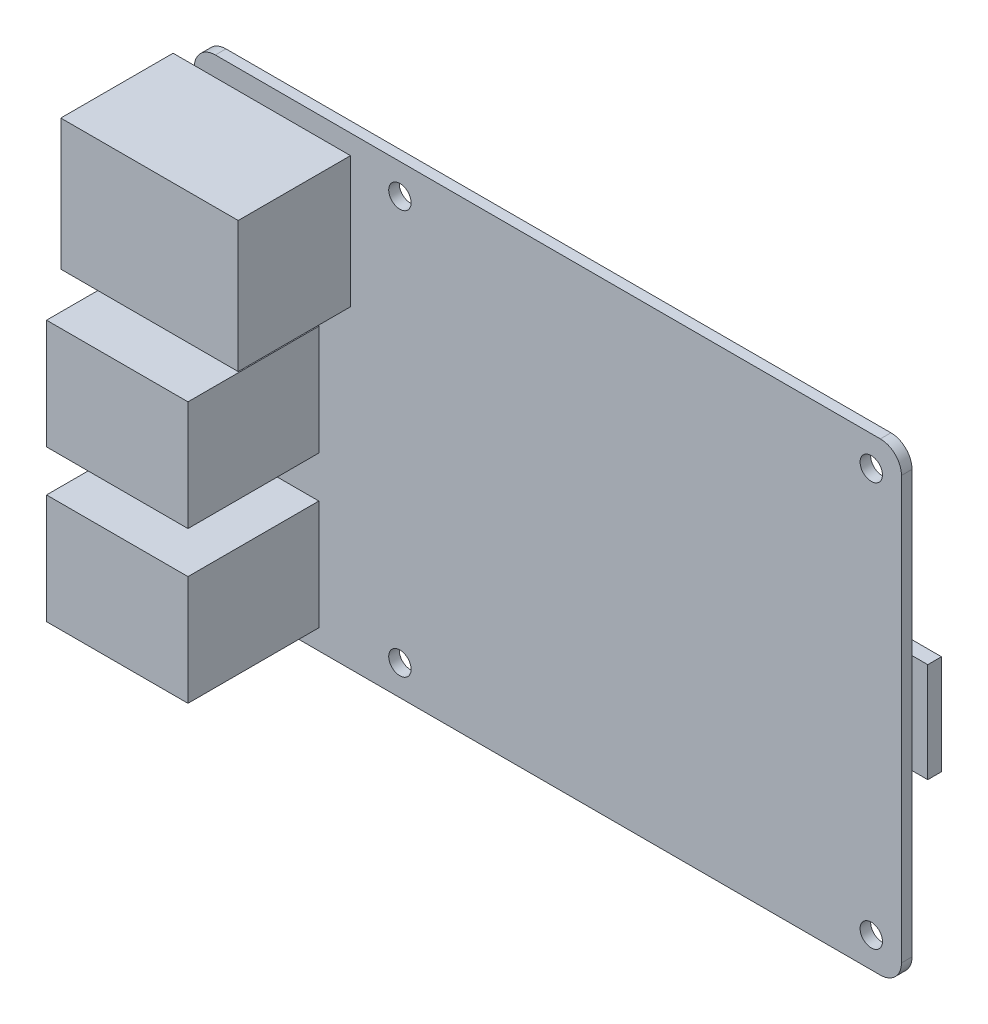
ISO-10303-21;
HEADER;
FILE_DESCRIPTION(('STEP AP214'),'2;1');
FILE_NAME('part.step','',(''),(''),'','','');
FILE_SCHEMA(('AUTOMOTIVE_DESIGN { 1 0 10303 214 1 1 1 1 }'));
ENDSEC;
DATA;
#1=APPLICATION_CONTEXT('core data for automotive mechanical design processes');
#2=APPLICATION_PROTOCOL_DEFINITION('international standard','automotive_design',2000,#1);
#3=PRODUCT_CONTEXT('',#1,'mechanical');
#4=PRODUCT('Part','Part','',(#3));
#5=PRODUCT_RELATED_PRODUCT_CATEGORY('part','',(#4));
#6=PRODUCT_DEFINITION_FORMATION('','',#4);
#7=PRODUCT_DEFINITION_CONTEXT('part definition',#1,'design');
#8=PRODUCT_DEFINITION('design','',#6,#7);
#9=PRODUCT_DEFINITION_SHAPE('','',#8);
#10=(LENGTH_UNIT() NAMED_UNIT(*) SI_UNIT(.MILLI.,.METRE.));
#11=(NAMED_UNIT(*) PLANE_ANGLE_UNIT() SI_UNIT($,.RADIAN.));
#12=(NAMED_UNIT(*) SI_UNIT($,.STERADIAN.) SOLID_ANGLE_UNIT());
#13=UNCERTAINTY_MEASURE_WITH_UNIT(LENGTH_MEASURE(1.E-05),#10,'distance_accuracy_value','');
#14=(GEOMETRIC_REPRESENTATION_CONTEXT(3) GLOBAL_UNCERTAINTY_ASSIGNED_CONTEXT((#13)) GLOBAL_UNIT_ASSIGNED_CONTEXT((#10,
#11,#12)) REPRESENTATION_CONTEXT('',''));
#15=CARTESIAN_POINT('',(0.,0.,0.));
#16=DIRECTION('',(0.,0.,1.));
#17=DIRECTION('',(1.,0.,0.));
#18=AXIS2_PLACEMENT_3D('',#15,#16,#17);
#19=CARTESIAN_POINT('',(0.,0.,0.));
#20=DIRECTION('',(0.,0.,1.));
#21=DIRECTION('',(1.,0.,0.));
#22=AXIS2_PLACEMENT_3D('',#19,#20,#21);
#23=PLANE('',#22);
#24=CARTESIAN_POINT('',(81.4578,52.2478,0.));
#25=DIRECTION('',(0.,0.,1.));
#26=DIRECTION('',(1.,0.,0.));
#27=AXIS2_PLACEMENT_3D('',#24,#25,#26);
#28=CIRCLE('',#27,1.3462);
#29=CARTESIAN_POINT('',(82.804,52.2478,0.));
#30=VERTEX_POINT('',#29);
#31=EDGE_CURVE('E378',#30,#30,#28,.T.);
#32=ORIENTED_EDGE('',*,*,#31,.T.);
#33=EDGE_LOOP('',(#32));
#34=FACE_BOUND('',#33,.T.);
#35=CARTESIAN_POINT('',(24.7396,52.2478,0.));
#36=DIRECTION('',(0.,0.,1.));
#37=DIRECTION('',(1.,0.,0.));
#38=AXIS2_PLACEMENT_3D('',#35,#36,#37);
#39=CIRCLE('',#38,1.3462);
#40=CARTESIAN_POINT('',(26.0858,52.2478,0.));
#41=VERTEX_POINT('',#40);
#42=EDGE_CURVE('E372',#41,#41,#39,.T.);
#43=ORIENTED_EDGE('',*,*,#42,.T.);
#44=EDGE_LOOP('',(#43));
#45=FACE_BOUND('',#44,.T.);
#46=CARTESIAN_POINT('',(24.7396,3.6322,0.));
#47=DIRECTION('',(0.,0.,1.));
#48=DIRECTION('',(1.,0.,0.));
#49=AXIS2_PLACEMENT_3D('',#46,#47,#48);
#50=CIRCLE('',#49,1.3462);
#51=CARTESIAN_POINT('',(26.0858,3.6322,0.));
#52=VERTEX_POINT('',#51);
#53=EDGE_CURVE('E366',#52,#52,#50,.T.);
#54=ORIENTED_EDGE('',*,*,#53,.T.);
#55=EDGE_LOOP('',(#54));
#56=FACE_BOUND('',#55,.T.);
#57=CARTESIAN_POINT('',(81.4578,3.6322,0.));
#58=DIRECTION('',(0.,0.,1.));
#59=DIRECTION('',(1.,0.,0.));
#60=AXIS2_PLACEMENT_3D('',#57,#58,#59);
#61=CIRCLE('',#60,1.34619999999999);
#62=CARTESIAN_POINT('',(82.804,3.6322,0.));
#63=VERTEX_POINT('',#62);
#64=EDGE_CURVE('E360',#63,#63,#61,.T.);
#65=ORIENTED_EDGE('',*,*,#64,.T.);
#66=EDGE_LOOP('',(#65));
#67=FACE_BOUND('',#66,.T.);
#68=DIRECTION('',(1.,0.,0.));
#69=VECTOR('',#68,1.);
#70=CARTESIAN_POINT('',(86.9823,33.9344,0.));
#71=LINE('',#70,#69);
#72=CARTESIAN_POINT('',(71.4883,33.9344,0.));
#73=VERTEX_POINT('',#72);
#74=CARTESIAN_POINT('',(85.09,33.9344,0.));
#75=VERTEX_POINT('',#74);
#76=EDGE_CURVE('E53',#73,#75,#71,.T.);
#77=ORIENTED_EDGE('',*,*,#76,.F.);
#78=DIRECTION('',(0.,1.,0.));
#79=VECTOR('',#78,1.);
#80=CARTESIAN_POINT('',(71.4883,33.9344,0.));
#81=LINE('',#80,#79);
#82=CARTESIAN_POINT('',(71.4883,21.9456,0.));
#83=VERTEX_POINT('',#82);
#84=EDGE_CURVE('E966',#83,#73,#81,.T.);
#85=ORIENTED_EDGE('',*,*,#84,.F.);
#86=DIRECTION('',(-1.,0.,0.));
#87=VECTOR('',#86,1.);
#88=CARTESIAN_POINT('',(86.9823,21.9456,0.));
#89=LINE('',#88,#87);
#90=CARTESIAN_POINT('',(85.09,21.9456,0.));
#91=VERTEX_POINT('',#90);
#92=EDGE_CURVE('E11',#91,#83,#89,.T.);
#93=ORIENTED_EDGE('',*,*,#92,.F.);
#94=DIRECTION('',(0.,1.,0.));
#95=VECTOR('',#94,1.);
#96=CARTESIAN_POINT('',(85.09,0.,0.));
#97=LINE('',#96,#95);
#98=CARTESIAN_POINT('',(85.09,2.54000000000001,0.));
#99=VERTEX_POINT('',#98);
#100=EDGE_CURVE('E400',#99,#91,#97,.T.);
#101=ORIENTED_EDGE('',*,*,#100,.F.);
#102=CARTESIAN_POINT('',(82.55,2.54000000000001,0.));
#103=DIRECTION('',(0.,0.,1.));
#104=DIRECTION('',(1.,0.,0.));
#105=AXIS2_PLACEMENT_3D('',#102,#103,#104);
#106=CIRCLE('',#105,2.54);
#107=CARTESIAN_POINT('',(82.55,0.,0.));
#108=VERTEX_POINT('',#107);
#109=EDGE_CURVE('E420',#99,#108,#106,.F.);
#110=ORIENTED_EDGE('',*,*,#109,.T.);
#111=DIRECTION('',(1.,0.,0.));
#112=VECTOR('',#111,1.);
#113=CARTESIAN_POINT('',(85.09,0.,0.));
#114=LINE('',#113,#112);
#115=CARTESIAN_POINT('',(2.54,0.,0.));
#116=VERTEX_POINT('',#115);
#117=EDGE_CURVE('E387',#116,#108,#114,.T.);
#118=ORIENTED_EDGE('',*,*,#117,.F.);
#119=CARTESIAN_POINT('',(2.54,2.54,0.));
#120=DIRECTION('',(0.,0.,1.));
#121=DIRECTION('',(1.,0.,0.));
#122=AXIS2_PLACEMENT_3D('',#119,#120,#121);
#123=CIRCLE('',#122,2.54);
#124=CARTESIAN_POINT('',(0.,2.54,0.));
#125=VERTEX_POINT('',#124);
#126=EDGE_CURVE('E422',#116,#125,#123,.F.);
#127=ORIENTED_EDGE('',*,*,#126,.T.);
#128=DIRECTION('',(0.,-1.,0.));
#129=VECTOR('',#128,1.);
#130=CARTESIAN_POINT('',(0.,0.,0.));
#131=LINE('',#130,#129);
#132=CARTESIAN_POINT('',(0.,53.34,0.));
#133=VERTEX_POINT('',#132);
#134=EDGE_CURVE('E407',#133,#125,#131,.T.);
#135=ORIENTED_EDGE('',*,*,#134,.F.);
#136=CARTESIAN_POINT('',(2.53999999999999,53.34,0.));
#137=DIRECTION('',(0.,0.,1.));
#138=DIRECTION('',(1.,0.,0.));
#139=AXIS2_PLACEMENT_3D('',#136,#137,#138);
#140=CIRCLE('',#139,2.54);
#141=CARTESIAN_POINT('',(2.53999999999999,55.88,0.));
#142=VERTEX_POINT('',#141);
#143=EDGE_CURVE('E416',#133,#142,#140,.F.);
#144=ORIENTED_EDGE('',*,*,#143,.T.);
#145=DIRECTION('',(-1.,0.,0.));
#146=VECTOR('',#145,1.);
#147=CARTESIAN_POINT('',(85.09,55.88,0.));
#148=LINE('',#147,#146);
#149=CARTESIAN_POINT('',(82.55,55.88,0.));
#150=VERTEX_POINT('',#149);
#151=EDGE_CURVE('E403',#150,#142,#148,.T.);
#152=ORIENTED_EDGE('',*,*,#151,.F.);
#153=CARTESIAN_POINT('',(82.55,53.34,0.));
#154=DIRECTION('',(0.,0.,1.));
#155=DIRECTION('',(1.,0.,0.));
#156=AXIS2_PLACEMENT_3D('',#153,#154,#155);
#157=CIRCLE('',#156,2.54);
#158=CARTESIAN_POINT('',(85.09,53.34,0.));
#159=VERTEX_POINT('',#158);
#160=EDGE_CURVE('E418',#150,#159,#157,.F.);
#161=ORIENTED_EDGE('',*,*,#160,.T.);
#162=EDGE_CURVE('E58',#75,#159,#97,.T.);
#163=ORIENTED_EDGE('',*,*,#162,.F.);
#164=EDGE_LOOP('',(#77,#85,#93,#101,#110,#118,#127,#135,#144,#152,#161,#163));
#165=FACE_BOUND('',#164,.T.);
#166=ADVANCED_FACE('F35',(#34,#45,#56,#67,#165),#23,.F.);
#167=CARTESIAN_POINT('',(0.,0.,1.27));
#168=DIRECTION('',(0.,0.,1.));
#169=DIRECTION('',(1.,0.,0.));
#170=AXIS2_PLACEMENT_3D('',#167,#168,#169);
#171=PLANE('',#170);
#172=CARTESIAN_POINT('',(81.4578,3.6322,1.27));
#173=DIRECTION('',(0.,0.,1.));
#174=DIRECTION('',(1.,0.,0.));
#175=AXIS2_PLACEMENT_3D('',#172,#173,#174);
#176=CIRCLE('',#175,1.34619999999999);
#177=CARTESIAN_POINT('',(82.804,3.6322,1.27));
#178=VERTEX_POINT('',#177);
#179=EDGE_CURVE('E359',#178,#178,#176,.T.);
#180=ORIENTED_EDGE('',*,*,#179,.F.);
#181=EDGE_LOOP('',(#180));
#182=FACE_BOUND('',#181,.T.);
#183=CARTESIAN_POINT('',(24.7396,3.6322,1.27));
#184=DIRECTION('',(0.,0.,1.));
#185=DIRECTION('',(1.,0.,0.));
#186=AXIS2_PLACEMENT_3D('',#183,#184,#185);
#187=CIRCLE('',#186,1.3462);
#188=CARTESIAN_POINT('',(26.0858,3.6322,1.27));
#189=VERTEX_POINT('',#188);
#190=EDGE_CURVE('E363',#189,#189,#187,.T.);
#191=ORIENTED_EDGE('',*,*,#190,.F.);
#192=EDGE_LOOP('',(#191));
#193=FACE_BOUND('',#192,.T.);
#194=CARTESIAN_POINT('',(24.7396,52.2478,1.27));
#195=DIRECTION('',(0.,0.,1.));
#196=DIRECTION('',(1.,0.,0.));
#197=AXIS2_PLACEMENT_3D('',#194,#195,#196);
#198=CIRCLE('',#197,1.3462);
#199=CARTESIAN_POINT('',(26.0858,52.2478,1.27));
#200=VERTEX_POINT('',#199);
#201=EDGE_CURVE('E369',#200,#200,#198,.T.);
#202=ORIENTED_EDGE('',*,*,#201,.F.);
#203=EDGE_LOOP('',(#202));
#204=FACE_BOUND('',#203,.T.);
#205=CARTESIAN_POINT('',(81.4578,52.2478,1.27));
#206=DIRECTION('',(0.,0.,1.));
#207=DIRECTION('',(1.,0.,0.));
#208=AXIS2_PLACEMENT_3D('',#205,#206,#207);
#209=CIRCLE('',#208,1.3462);
#210=CARTESIAN_POINT('',(82.804,52.2478,1.27));
#211=VERTEX_POINT('',#210);
#212=EDGE_CURVE('E375',#211,#211,#209,.T.);
#213=ORIENTED_EDGE('',*,*,#212,.F.);
#214=EDGE_LOOP('',(#213));
#215=FACE_BOUND('',#214,.T.);
#216=DIRECTION('',(0.,1.,0.));
#217=VECTOR('',#216,1.);
#218=CARTESIAN_POINT('',(18.796,53.5178,1.27));
#219=LINE('',#218,#217);
#220=CARTESIAN_POINT('',(18.796,37.7698,1.27));
#221=VERTEX_POINT('',#220);
#222=CARTESIAN_POINT('',(18.796,53.5178,1.27));
#223=VERTEX_POINT('',#222);
#224=EDGE_CURVE('E270',#221,#223,#219,.T.);
#225=ORIENTED_EDGE('',*,*,#224,.F.);
#226=DIRECTION('',(1.,0.,0.));
#227=VECTOR('',#226,1.);
#228=CARTESIAN_POINT('',(-2.55269999999998,37.7698,1.27));
#229=LINE('',#228,#227);
#230=CARTESIAN_POINT('',(0.,37.7698,1.27));
#231=VERTEX_POINT('',#230);
#232=EDGE_CURVE('E250',#231,#221,#229,.T.);
#233=ORIENTED_EDGE('',*,*,#232,.F.);
#234=DIRECTION('',(0.,-1.,0.));
#235=VECTOR('',#234,1.);
#236=CARTESIAN_POINT('',(0.,0.,1.27));
#237=LINE('',#236,#235);
#238=CARTESIAN_POINT('',(0.,33.8328,1.27));
#239=VERTEX_POINT('',#238);
#240=EDGE_CURVE('E395',#231,#239,#237,.T.);
#241=ORIENTED_EDGE('',*,*,#240,.T.);
#242=DIRECTION('',(-1.,0.,0.));
#243=VECTOR('',#242,1.);
#244=CARTESIAN_POINT('',(-2.03199999999999,33.8328,1.27));
#245=LINE('',#244,#243);
#246=CARTESIAN_POINT('',(14.986,33.8328,1.27));
#247=VERTEX_POINT('',#246);
#248=EDGE_CURVE('E330',#247,#239,#245,.T.);
#249=ORIENTED_EDGE('',*,*,#248,.F.);
#250=DIRECTION('',(0.,1.,0.));
#251=VECTOR('',#250,1.);
#252=CARTESIAN_POINT('',(14.986,33.8328,1.27));
#253=LINE('',#252,#251);
#254=CARTESIAN_POINT('',(14.986,20.6248,1.27));
#255=VERTEX_POINT('',#254);
#256=EDGE_CURVE('E342',#255,#247,#253,.T.);
#257=ORIENTED_EDGE('',*,*,#256,.F.);
#258=DIRECTION('',(1.,0.,0.));
#259=VECTOR('',#258,1.);
#260=CARTESIAN_POINT('',(-2.03199999999999,20.6248,1.27));
#261=LINE('',#260,#259);
#262=CARTESIAN_POINT('',(0.,20.6248,1.27));
#263=VERTEX_POINT('',#262);
#264=EDGE_CURVE('E44',#263,#255,#261,.T.);
#265=ORIENTED_EDGE('',*,*,#264,.F.);
#266=CARTESIAN_POINT('',(0.,15.621,1.27));
#267=VERTEX_POINT('',#266);
#268=EDGE_CURVE('E390',#263,#267,#237,.T.);
#269=ORIENTED_EDGE('',*,*,#268,.T.);
#270=DIRECTION('',(-1.,0.,0.));
#271=VECTOR('',#270,1.);
#272=CARTESIAN_POINT('',(-2.03199999999999,15.621,1.27));
#273=LINE('',#272,#271);
#274=CARTESIAN_POINT('',(14.986,15.621,1.27));
#275=VERTEX_POINT('',#274);
#276=EDGE_CURVE('E292',#275,#267,#273,.T.);
#277=ORIENTED_EDGE('',*,*,#276,.F.);
#278=DIRECTION('',(0.,1.,0.));
#279=VECTOR('',#278,1.);
#280=CARTESIAN_POINT('',(14.986,15.621,1.27));
#281=LINE('',#280,#279);
#282=CARTESIAN_POINT('',(14.986,2.413,1.27));
#283=VERTEX_POINT('',#282);
#284=EDGE_CURVE('E305',#283,#275,#281,.T.);
#285=ORIENTED_EDGE('',*,*,#284,.F.);
#286=DIRECTION('',(1.,0.,0.));
#287=VECTOR('',#286,1.);
#288=CARTESIAN_POINT('',(-2.03199999999998,2.413,1.27));
#289=LINE('',#288,#287);
#290=CARTESIAN_POINT('',(0.00317698685935175,2.413,1.27));
#291=VERTEX_POINT('',#290);
#292=EDGE_CURVE('E301',#291,#283,#289,.T.);
#293=ORIENTED_EDGE('',*,*,#292,.F.);
#294=CARTESIAN_POINT('',(2.54,2.54,1.27));
#295=DIRECTION('',(0.,0.,1.));
#296=DIRECTION('',(1.,0.,0.));
#297=AXIS2_PLACEMENT_3D('',#294,#295,#296);
#298=CIRCLE('',#297,2.54);
#299=CARTESIAN_POINT('',(2.54,0.,1.27));
#300=VERTEX_POINT('',#299);
#301=EDGE_CURVE('E437',#291,#300,#298,.T.);
#302=ORIENTED_EDGE('',*,*,#301,.T.);
#303=DIRECTION('',(1.,0.,0.));
#304=VECTOR('',#303,1.);
#305=CARTESIAN_POINT('',(85.09,0.,1.27));
#306=LINE('',#305,#304);
#307=CARTESIAN_POINT('',(82.55,0.,1.27));
#308=VERTEX_POINT('',#307);
#309=EDGE_CURVE('E394',#300,#308,#306,.T.);
#310=ORIENTED_EDGE('',*,*,#309,.T.);
#311=CARTESIAN_POINT('',(82.55,2.54000000000001,1.27));
#312=DIRECTION('',(0.,0.,1.));
#313=DIRECTION('',(1.,0.,0.));
#314=AXIS2_PLACEMENT_3D('',#311,#312,#313);
#315=CIRCLE('',#314,2.54);
#316=CARTESIAN_POINT('',(85.09,2.54000000000001,1.27));
#317=VERTEX_POINT('',#316);
#318=EDGE_CURVE('E435',#308,#317,#315,.T.);
#319=ORIENTED_EDGE('',*,*,#318,.T.);
#320=DIRECTION('',(0.,1.,0.));
#321=VECTOR('',#320,1.);
#322=CARTESIAN_POINT('',(85.09,0.,1.27));
#323=LINE('',#322,#321);
#324=CARTESIAN_POINT('',(85.09,53.34,1.27));
#325=VERTEX_POINT('',#324);
#326=EDGE_CURVE('E383',#317,#325,#323,.T.);
#327=ORIENTED_EDGE('',*,*,#326,.T.);
#328=CARTESIAN_POINT('',(82.55,53.34,1.27));
#329=DIRECTION('',(0.,0.,1.));
#330=DIRECTION('',(1.,0.,0.));
#331=AXIS2_PLACEMENT_3D('',#328,#329,#330);
#332=CIRCLE('',#331,2.54);
#333=CARTESIAN_POINT('',(82.55,55.88,1.27));
#334=VERTEX_POINT('',#333);
#335=EDGE_CURVE('E433',#325,#334,#332,.T.);
#336=ORIENTED_EDGE('',*,*,#335,.T.);
#337=DIRECTION('',(-1.,0.,0.));
#338=VECTOR('',#337,1.);
#339=CARTESIAN_POINT('',(85.09,55.88,1.27));
#340=LINE('',#339,#338);
#341=CARTESIAN_POINT('',(2.53999999999999,55.88,1.27));
#342=VERTEX_POINT('',#341);
#343=EDGE_CURVE('E386',#334,#342,#340,.T.);
#344=ORIENTED_EDGE('',*,*,#343,.T.);
#345=CARTESIAN_POINT('',(2.53999999999999,53.34,1.27));
#346=DIRECTION('',(0.,0.,1.));
#347=DIRECTION('',(1.,0.,0.));
#348=AXIS2_PLACEMENT_3D('',#345,#346,#347);
#349=CIRCLE('',#348,2.54);
#350=CARTESIAN_POINT('',(0.00623064190916024,53.5178,1.27));
#351=VERTEX_POINT('',#350);
#352=EDGE_CURVE('E430',#342,#351,#349,.T.);
#353=ORIENTED_EDGE('',*,*,#352,.T.);
#354=DIRECTION('',(-1.,0.,0.));
#355=VECTOR('',#354,1.);
#356=CARTESIAN_POINT('',(-2.55269999999998,53.5178,1.27));
#357=LINE('',#356,#355);
#358=EDGE_CURVE('E260',#223,#351,#357,.T.);
#359=ORIENTED_EDGE('',*,*,#358,.F.);
#360=EDGE_LOOP('',(#225,#233,#241,#249,#257,#265,#269,#277,#285,#293,#302,#310,#319,#327,#336,
#344,#353,#359));
#361=FACE_BOUND('',#360,.T.);
#362=ADVANCED_FACE('F480',(#182,#193,#204,#215,#361),#171,.T.);
#363=CARTESIAN_POINT('',(85.09,0.,1.27));
#364=DIRECTION('',(-1.,0.,0.));
#365=DIRECTION('',(0.,-1.,0.));
#366=AXIS2_PLACEMENT_3D('',#363,#364,#365);
#367=PLANE('',#366);
#368=ORIENTED_EDGE('',*,*,#326,.F.);
#369=DIRECTION('',(0.,0.,-1.));
#370=VECTOR('',#369,1.);
#371=CARTESIAN_POINT('',(85.09,2.54000000000001,1.27));
#372=LINE('',#371,#370);
#373=EDGE_CURVE('E443',#317,#99,#372,.T.);
#374=ORIENTED_EDGE('',*,*,#373,.T.);
#375=ORIENTED_EDGE('',*,*,#100,.T.);
#376=EDGE_CURVE('E404',#91,#75,#97,.T.);
#377=ORIENTED_EDGE('',*,*,#376,.T.);
#378=ORIENTED_EDGE('',*,*,#162,.T.);
#379=DIRECTION('',(0.,0.,-1.));
#380=VECTOR('',#379,1.);
#381=CARTESIAN_POINT('',(85.09,53.34,1.27));
#382=LINE('',#381,#380);
#383=EDGE_CURVE('E441',#159,#325,#382,.F.);
#384=ORIENTED_EDGE('',*,*,#383,.T.);
#385=EDGE_LOOP('',(#368,#374,#375,#377,#378,#384));
#386=FACE_BOUND('',#385,.T.);
#387=ADVANCED_FACE('F515',(#386),#367,.F.);
#388=CARTESIAN_POINT('',(85.09,55.88,1.27));
#389=DIRECTION('',(0.,-1.,0.));
#390=DIRECTION('',(0.,0.,-1.));
#391=AXIS2_PLACEMENT_3D('',#388,#389,#390);
#392=PLANE('',#391);
#393=ORIENTED_EDGE('',*,*,#343,.F.);
#394=DIRECTION('',(0.,0.,-1.));
#395=VECTOR('',#394,1.);
#396=CARTESIAN_POINT('',(82.55,55.88,1.27));
#397=LINE('',#396,#395);
#398=EDGE_CURVE('E39',#334,#150,#397,.T.);
#399=ORIENTED_EDGE('',*,*,#398,.T.);
#400=ORIENTED_EDGE('',*,*,#151,.T.);
#401=DIRECTION('',(0.,0.,-1.));
#402=VECTOR('',#401,1.);
#403=CARTESIAN_POINT('',(2.53999999999999,55.88,1.27));
#404=LINE('',#403,#402);
#405=EDGE_CURVE('E445',#142,#342,#404,.F.);
#406=ORIENTED_EDGE('',*,*,#405,.T.);
#407=EDGE_LOOP('',(#393,#399,#400,#406));
#408=FACE_BOUND('',#407,.T.);
#409=ADVANCED_FACE('F521',(#408),#392,.F.);
#410=CARTESIAN_POINT('',(0.,0.,1.27));
#411=DIRECTION('',(1.,0.,0.));
#412=DIRECTION('',(0.,1.,0.));
#413=AXIS2_PLACEMENT_3D('',#410,#411,#412);
#414=PLANE('',#413);
#415=ORIENTED_EDGE('',*,*,#134,.T.);
#416=DIRECTION('',(0.,0.,-1.));
#417=VECTOR('',#416,1.);
#418=CARTESIAN_POINT('',(0.,2.54,1.27));
#419=LINE('',#418,#417);
#420=CARTESIAN_POINT('',(0.,2.54,1.27));
#421=VERTEX_POINT('',#420);
#422=EDGE_CURVE('E427',#125,#421,#419,.F.);
#423=ORIENTED_EDGE('',*,*,#422,.T.);
#424=DIRECTION('',(0.,-1.,0.));
#425=VECTOR('',#424,1.);
#426=CARTESIAN_POINT('',(0.,0.,1.27));
#427=LINE('',#426,#425);
#428=EDGE_CURVE('E322',#267,#421,#427,.T.);
#429=ORIENTED_EDGE('',*,*,#428,.F.);
#430=ORIENTED_EDGE('',*,*,#268,.F.);
#431=EDGE_CURVE('E396',#239,#263,#237,.T.);
#432=ORIENTED_EDGE('',*,*,#431,.F.);
#433=ORIENTED_EDGE('',*,*,#240,.F.);
#434=CARTESIAN_POINT('',(0.,53.34,1.27));
#435=VERTEX_POINT('',#434);
#436=EDGE_CURVE('E391',#435,#231,#237,.T.);
#437=ORIENTED_EDGE('',*,*,#436,.F.);
#438=DIRECTION('',(0.,0.,-1.));
#439=VECTOR('',#438,1.);
#440=CARTESIAN_POINT('',(0.,53.34,1.27));
#441=LINE('',#440,#439);
#442=EDGE_CURVE('E424',#435,#133,#441,.T.);
#443=ORIENTED_EDGE('',*,*,#442,.T.);
#444=EDGE_LOOP('',(#415,#423,#429,#430,#432,#433,#437,#443));
#445=FACE_BOUND('',#444,.T.);
#446=ADVANCED_FACE('F523',(#445),#414,.F.);
#447=CARTESIAN_POINT('',(85.09,0.,1.27));
#448=DIRECTION('',(0.,1.,0.));
#449=DIRECTION('',(-1.,0.,0.));
#450=AXIS2_PLACEMENT_3D('',#447,#448,#449);
#451=PLANE('',#450);
#452=ORIENTED_EDGE('',*,*,#309,.F.);
#453=DIRECTION('',(0.,0.,-1.));
#454=VECTOR('',#453,1.);
#455=CARTESIAN_POINT('',(2.54,0.,1.27));
#456=LINE('',#455,#454);
#457=EDGE_CURVE('E413',#300,#116,#456,.T.);
#458=ORIENTED_EDGE('',*,*,#457,.T.);
#459=ORIENTED_EDGE('',*,*,#117,.T.);
#460=DIRECTION('',(0.,0.,-1.));
#461=VECTOR('',#460,1.);
#462=CARTESIAN_POINT('',(82.55,0.,1.27));
#463=LINE('',#462,#461);
#464=EDGE_CURVE('E399',#108,#308,#463,.F.);
#465=ORIENTED_EDGE('',*,*,#464,.T.);
#466=EDGE_LOOP('',(#452,#458,#459,#465));
#467=FACE_BOUND('',#466,.T.);
#468=ADVANCED_FACE('F506',(#467),#451,.F.);
#469=CARTESIAN_POINT('',(2.54,2.54,1.27));
#470=DIRECTION('',(0.,0.,-1.));
#471=DIRECTION('',(-1.,0.,0.));
#472=AXIS2_PLACEMENT_3D('',#469,#470,#471);
#473=CYLINDRICAL_SURFACE('',#472,2.54);
#474=EDGE_CURVE('E438',#421,#291,#298,.T.);
#475=ORIENTED_EDGE('',*,*,#474,.F.);
#476=ORIENTED_EDGE('',*,*,#422,.F.);
#477=ORIENTED_EDGE('',*,*,#126,.F.);
#478=ORIENTED_EDGE('',*,*,#457,.F.);
#479=ORIENTED_EDGE('',*,*,#301,.F.);
#480=EDGE_LOOP('',(#475,#476,#477,#478,#479));
#481=FACE_BOUND('',#480,.T.);
#482=ADVANCED_FACE('F501',(#481),#473,.T.);
#483=CARTESIAN_POINT('',(82.55,2.54000000000001,1.27));
#484=DIRECTION('',(0.,0.,-1.));
#485=DIRECTION('',(-1.,0.,0.));
#486=AXIS2_PLACEMENT_3D('',#483,#484,#485);
#487=CYLINDRICAL_SURFACE('',#486,2.54);
#488=ORIENTED_EDGE('',*,*,#318,.F.);
#489=ORIENTED_EDGE('',*,*,#464,.F.);
#490=ORIENTED_EDGE('',*,*,#109,.F.);
#491=ORIENTED_EDGE('',*,*,#373,.F.);
#492=EDGE_LOOP('',(#488,#489,#490,#491));
#493=FACE_BOUND('',#492,.T.);
#494=ADVANCED_FACE('F510',(#493),#487,.T.);
#495=CARTESIAN_POINT('',(82.55,53.34,1.27));
#496=DIRECTION('',(0.,0.,-1.));
#497=DIRECTION('',(-1.,0.,0.));
#498=AXIS2_PLACEMENT_3D('',#495,#496,#497);
#499=CYLINDRICAL_SURFACE('',#498,2.54);
#500=ORIENTED_EDGE('',*,*,#335,.F.);
#501=ORIENTED_EDGE('',*,*,#383,.F.);
#502=ORIENTED_EDGE('',*,*,#160,.F.);
#503=ORIENTED_EDGE('',*,*,#398,.F.);
#504=EDGE_LOOP('',(#500,#501,#502,#503));
#505=FACE_BOUND('',#504,.T.);
#506=ADVANCED_FACE('F519',(#505),#499,.T.);
#507=CARTESIAN_POINT('',(2.53999999999999,53.34,1.27));
#508=DIRECTION('',(0.,0.,-1.));
#509=DIRECTION('',(-1.,0.,0.));
#510=AXIS2_PLACEMENT_3D('',#507,#508,#509);
#511=CYLINDRICAL_SURFACE('',#510,2.54);
#512=ORIENTED_EDGE('',*,*,#352,.F.);
#513=ORIENTED_EDGE('',*,*,#405,.F.);
#514=ORIENTED_EDGE('',*,*,#143,.F.);
#515=ORIENTED_EDGE('',*,*,#442,.F.);
#516=EDGE_CURVE('E429',#351,#435,#349,.T.);
#517=ORIENTED_EDGE('',*,*,#516,.F.);
#518=EDGE_LOOP('',(#512,#513,#514,#515,#517));
#519=FACE_BOUND('',#518,.T.);
#520=ADVANCED_FACE('F37',(#519),#511,.T.);
#521=CARTESIAN_POINT('',(81.4578,52.2478,0.));
#522=DIRECTION('',(0.,0.,1.));
#523=DIRECTION('',(1.,0.,0.));
#524=AXIS2_PLACEMENT_3D('',#521,#522,#523);
#525=CYLINDRICAL_SURFACE('',#524,1.3462);
#526=ORIENTED_EDGE('',*,*,#31,.F.);
#527=EDGE_LOOP('',(#526));
#528=FACE_BOUND('',#527,.T.);
#529=ORIENTED_EDGE('',*,*,#212,.T.);
#530=EDGE_LOOP('',(#529));
#531=FACE_BOUND('',#530,.T.);
#532=ADVANCED_FACE('F555',(#528,#531),#525,.F.);
#533=CARTESIAN_POINT('',(24.7396,52.2478,0.));
#534=DIRECTION('',(0.,0.,1.));
#535=DIRECTION('',(1.,0.,0.));
#536=AXIS2_PLACEMENT_3D('',#533,#534,#535);
#537=CYLINDRICAL_SURFACE('',#536,1.3462);
#538=ORIENTED_EDGE('',*,*,#42,.F.);
#539=EDGE_LOOP('',(#538));
#540=FACE_BOUND('',#539,.T.);
#541=ORIENTED_EDGE('',*,*,#201,.T.);
#542=EDGE_LOOP('',(#541));
#543=FACE_BOUND('',#542,.T.);
#544=ADVANCED_FACE('F560',(#540,#543),#537,.F.);
#545=CARTESIAN_POINT('',(24.7396,3.6322,0.));
#546=DIRECTION('',(0.,0.,1.));
#547=DIRECTION('',(1.,0.,0.));
#548=AXIS2_PLACEMENT_3D('',#545,#546,#547);
#549=CYLINDRICAL_SURFACE('',#548,1.3462);
#550=ORIENTED_EDGE('',*,*,#53,.F.);
#551=EDGE_LOOP('',(#550));
#552=FACE_BOUND('',#551,.T.);
#553=ORIENTED_EDGE('',*,*,#190,.T.);
#554=EDGE_LOOP('',(#553));
#555=FACE_BOUND('',#554,.T.);
#556=ADVANCED_FACE('F601',(#552,#555),#549,.F.);
#557=CARTESIAN_POINT('',(81.4578,3.6322,0.));
#558=DIRECTION('',(0.,0.,1.));
#559=DIRECTION('',(1.,0.,0.));
#560=AXIS2_PLACEMENT_3D('',#557,#558,#559);
#561=CYLINDRICAL_SURFACE('',#560,1.34619999999999);
#562=ORIENTED_EDGE('',*,*,#64,.F.);
#563=EDGE_LOOP('',(#562));
#564=FACE_BOUND('',#563,.T.);
#565=ORIENTED_EDGE('',*,*,#179,.T.);
#566=EDGE_LOOP('',(#565));
#567=FACE_BOUND('',#566,.T.);
#568=ADVANCED_FACE('F598',(#564,#567),#561,.F.);
#569=CARTESIAN_POINT('',(0.,0.,1.27));
#570=DIRECTION('',(0.,0.,1.));
#571=DIRECTION('',(1.,0.,0.));
#572=AXIS2_PLACEMENT_3D('',#569,#570,#571);
#573=PLANE('',#572);
#574=CARTESIAN_POINT('',(-2.03199999999999,33.8328,1.27));
#575=VERTEX_POINT('',#574);
#576=EDGE_CURVE('E345',#239,#575,#245,.T.);
#577=ORIENTED_EDGE('',*,*,#576,.F.);
#578=ORIENTED_EDGE('',*,*,#431,.T.);
#579=CARTESIAN_POINT('',(-2.03199999999999,20.6248,1.27));
#580=VERTEX_POINT('',#579);
#581=EDGE_CURVE('E339',#580,#263,#261,.T.);
#582=ORIENTED_EDGE('',*,*,#581,.F.);
#583=DIRECTION('',(0.,-1.,0.));
#584=VECTOR('',#583,1.);
#585=CARTESIAN_POINT('',(-2.03199999999999,33.8328,1.27));
#586=LINE('',#585,#584);
#587=EDGE_CURVE('E325',#575,#580,#586,.T.);
#588=ORIENTED_EDGE('',*,*,#587,.F.);
#589=EDGE_LOOP('',(#577,#578,#582,#588));
#590=FACE_BOUND('',#589,.T.);
#591=ADVANCED_FACE('F474',(#590),#573,.F.);
#592=CARTESIAN_POINT('',(-2.03199999999999,33.8328,17.018));
#593=DIRECTION('',(1.,0.,0.));
#594=DIRECTION('',(0.,1.,0.));
#595=AXIS2_PLACEMENT_3D('',#592,#593,#594);
#596=PLANE('',#595);
#597=ORIENTED_EDGE('',*,*,#587,.T.);
#598=DIRECTION('',(0.,0.,-1.));
#599=VECTOR('',#598,1.);
#600=CARTESIAN_POINT('',(-2.03199999999999,20.6248,17.018));
#601=LINE('',#600,#599);
#602=CARTESIAN_POINT('',(-2.03199999999999,20.6248,17.018));
#603=VERTEX_POINT('',#602);
#604=EDGE_CURVE('E356',#603,#580,#601,.T.);
#605=ORIENTED_EDGE('',*,*,#604,.F.);
#606=DIRECTION('',(0.,-1.,0.));
#607=VECTOR('',#606,1.);
#608=CARTESIAN_POINT('',(-2.03199999999999,33.8328,17.018));
#609=LINE('',#608,#607);
#610=CARTESIAN_POINT('',(-2.03199999999999,33.8328,17.018));
#611=VERTEX_POINT('',#610);
#612=EDGE_CURVE('E326',#611,#603,#609,.T.);
#613=ORIENTED_EDGE('',*,*,#612,.F.);
#614=DIRECTION('',(0.,0.,-1.));
#615=VECTOR('',#614,1.);
#616=CARTESIAN_POINT('',(-2.03199999999999,33.8328,17.018));
#617=LINE('',#616,#615);
#618=EDGE_CURVE('E336',#611,#575,#617,.T.);
#619=ORIENTED_EDGE('',*,*,#618,.T.);
#620=EDGE_LOOP('',(#597,#605,#613,#619));
#621=FACE_BOUND('',#620,.T.);
#622=ADVANCED_FACE('F471',(#621),#596,.F.);
#623=CARTESIAN_POINT('',(-2.03199999999999,20.6248,17.018));
#624=DIRECTION('',(0.,1.,0.));
#625=DIRECTION('',(-1.,0.,0.));
#626=AXIS2_PLACEMENT_3D('',#623,#624,#625);
#627=PLANE('',#626);
#628=ORIENTED_EDGE('',*,*,#581,.T.);
#629=ORIENTED_EDGE('',*,*,#264,.T.);
#630=DIRECTION('',(0.,0.,-1.));
#631=VECTOR('',#630,1.);
#632=CARTESIAN_POINT('',(14.986,20.6248,17.018));
#633=LINE('',#632,#631);
#634=CARTESIAN_POINT('',(14.986,20.6248,17.018));
#635=VERTEX_POINT('',#634);
#636=EDGE_CURVE('E353',#635,#255,#633,.T.);
#637=ORIENTED_EDGE('',*,*,#636,.F.);
#638=DIRECTION('',(1.,0.,0.));
#639=VECTOR('',#638,1.);
#640=CARTESIAN_POINT('',(-2.03199999999999,20.6248,17.018));
#641=LINE('',#640,#639);
#642=EDGE_CURVE('E329',#603,#635,#641,.T.);
#643=ORIENTED_EDGE('',*,*,#642,.F.);
#644=ORIENTED_EDGE('',*,*,#604,.T.);
#645=EDGE_LOOP('',(#628,#629,#637,#643,#644));
#646=FACE_BOUND('',#645,.T.);
#647=ADVANCED_FACE('F455',(#646),#627,.F.);
#648=CARTESIAN_POINT('',(14.986,33.8328,17.018));
#649=DIRECTION('',(-1.,0.,0.));
#650=DIRECTION('',(0.,-1.,0.));
#651=AXIS2_PLACEMENT_3D('',#648,#649,#650);
#652=PLANE('',#651);
#653=ORIENTED_EDGE('',*,*,#256,.T.);
#654=DIRECTION('',(0.,0.,-1.));
#655=VECTOR('',#654,1.);
#656=CARTESIAN_POINT('',(14.986,33.8328,17.018));
#657=LINE('',#656,#655);
#658=CARTESIAN_POINT('',(14.986,33.8328,17.018));
#659=VERTEX_POINT('',#658);
#660=EDGE_CURVE('E350',#659,#247,#657,.T.);
#661=ORIENTED_EDGE('',*,*,#660,.F.);
#662=DIRECTION('',(0.,1.,0.));
#663=VECTOR('',#662,1.);
#664=CARTESIAN_POINT('',(14.986,33.8328,17.018));
#665=LINE('',#664,#663);
#666=EDGE_CURVE('E332',#635,#659,#665,.T.);
#667=ORIENTED_EDGE('',*,*,#666,.F.);
#668=ORIENTED_EDGE('',*,*,#636,.T.);
#669=EDGE_LOOP('',(#653,#661,#667,#668));
#670=FACE_BOUND('',#669,.T.);
#671=ADVANCED_FACE('F461',(#670),#652,.F.);
#672=CARTESIAN_POINT('',(-2.03199999999999,33.8328,17.018));
#673=DIRECTION('',(0.,-1.,0.));
#674=DIRECTION('',(1.,0.,0.));
#675=AXIS2_PLACEMENT_3D('',#672,#673,#674);
#676=PLANE('',#675);
#677=ORIENTED_EDGE('',*,*,#248,.T.);
#678=ORIENTED_EDGE('',*,*,#576,.T.);
#679=ORIENTED_EDGE('',*,*,#618,.F.);
#680=DIRECTION('',(-1.,0.,0.));
#681=VECTOR('',#680,1.);
#682=CARTESIAN_POINT('',(-2.03199999999999,33.8328,17.018));
#683=LINE('',#682,#681);
#684=EDGE_CURVE('E334',#659,#611,#683,.T.);
#685=ORIENTED_EDGE('',*,*,#684,.F.);
#686=ORIENTED_EDGE('',*,*,#660,.T.);
#687=EDGE_LOOP('',(#677,#678,#679,#685,#686));
#688=FACE_BOUND('',#687,.T.);
#689=ADVANCED_FACE('F583',(#688),#676,.F.);
#690=CARTESIAN_POINT('',(0.,0.,17.018));
#691=DIRECTION('',(0.,0.,1.));
#692=DIRECTION('',(1.,0.,0.));
#693=AXIS2_PLACEMENT_3D('',#690,#691,#692);
#694=PLANE('',#693);
#695=ORIENTED_EDGE('',*,*,#612,.T.);
#696=ORIENTED_EDGE('',*,*,#642,.T.);
#697=ORIENTED_EDGE('',*,*,#666,.T.);
#698=ORIENTED_EDGE('',*,*,#684,.T.);
#699=EDGE_LOOP('',(#695,#696,#697,#698));
#700=FACE_BOUND('',#699,.T.);
#701=ADVANCED_FACE('F465',(#700),#694,.T.);
#702=CARTESIAN_POINT('',(0.,0.,1.27));
#703=DIRECTION('',(0.,0.,1.));
#704=DIRECTION('',(1.,0.,0.));
#705=AXIS2_PLACEMENT_3D('',#702,#703,#704);
#706=PLANE('',#705);
#707=CARTESIAN_POINT('',(-2.03199999999999,15.621,1.27));
#708=VERTEX_POINT('',#707);
#709=EDGE_CURVE('E308',#267,#708,#273,.T.);
#710=ORIENTED_EDGE('',*,*,#709,.F.);
#711=ORIENTED_EDGE('',*,*,#428,.T.);
#712=ORIENTED_EDGE('',*,*,#474,.T.);
#713=CARTESIAN_POINT('',(-2.03199999999998,2.413,1.27));
#714=VERTEX_POINT('',#713);
#715=EDGE_CURVE('E302',#714,#291,#289,.T.);
#716=ORIENTED_EDGE('',*,*,#715,.F.);
#717=DIRECTION('',(0.,-1.,0.));
#718=VECTOR('',#717,1.);
#719=CARTESIAN_POINT('',(-2.03199999999999,15.621,1.27));
#720=LINE('',#719,#718);
#721=EDGE_CURVE('E287',#708,#714,#720,.T.);
#722=ORIENTED_EDGE('',*,*,#721,.F.);
#723=EDGE_LOOP('',(#710,#711,#712,#716,#722));
#724=FACE_BOUND('',#723,.T.);
#725=ADVANCED_FACE('F483',(#724),#706,.F.);
#726=CARTESIAN_POINT('',(-2.03199999999999,15.621,17.018));
#727=DIRECTION('',(1.,0.,0.));
#728=DIRECTION('',(0.,1.,0.));
#729=AXIS2_PLACEMENT_3D('',#726,#727,#728);
#730=PLANE('',#729);
#731=ORIENTED_EDGE('',*,*,#721,.T.);
#732=DIRECTION('',(0.,0.,-1.));
#733=VECTOR('',#732,1.);
#734=CARTESIAN_POINT('',(-2.03199999999998,2.413,17.018));
#735=LINE('',#734,#733);
#736=CARTESIAN_POINT('',(-2.03199999999998,2.413,17.018));
#737=VERTEX_POINT('',#736);
#738=EDGE_CURVE('E319',#737,#714,#735,.T.);
#739=ORIENTED_EDGE('',*,*,#738,.F.);
#740=DIRECTION('',(0.,-1.,0.));
#741=VECTOR('',#740,1.);
#742=CARTESIAN_POINT('',(-2.03199999999999,15.621,17.018));
#743=LINE('',#742,#741);
#744=CARTESIAN_POINT('',(-2.03199999999999,15.621,17.018));
#745=VERTEX_POINT('',#744);
#746=EDGE_CURVE('E288',#745,#737,#743,.T.);
#747=ORIENTED_EDGE('',*,*,#746,.F.);
#748=DIRECTION('',(0.,0.,-1.));
#749=VECTOR('',#748,1.);
#750=CARTESIAN_POINT('',(-2.03199999999999,15.621,17.018));
#751=LINE('',#750,#749);
#752=EDGE_CURVE('E298',#745,#708,#751,.T.);
#753=ORIENTED_EDGE('',*,*,#752,.T.);
#754=EDGE_LOOP('',(#731,#739,#747,#753));
#755=FACE_BOUND('',#754,.T.);
#756=ADVANCED_FACE('F673',(#755),#730,.F.);
#757=CARTESIAN_POINT('',(-2.03199999999998,2.413,17.018));
#758=DIRECTION('',(0.,1.,0.));
#759=DIRECTION('',(-1.,0.,0.));
#760=AXIS2_PLACEMENT_3D('',#757,#758,#759);
#761=PLANE('',#760);
#762=ORIENTED_EDGE('',*,*,#715,.T.);
#763=ORIENTED_EDGE('',*,*,#292,.T.);
#764=DIRECTION('',(0.,0.,-1.));
#765=VECTOR('',#764,1.);
#766=CARTESIAN_POINT('',(14.986,2.413,17.018));
#767=LINE('',#766,#765);
#768=CARTESIAN_POINT('',(14.986,2.413,17.018));
#769=VERTEX_POINT('',#768);
#770=EDGE_CURVE('E316',#769,#283,#767,.T.);
#771=ORIENTED_EDGE('',*,*,#770,.F.);
#772=DIRECTION('',(1.,0.,0.));
#773=VECTOR('',#772,1.);
#774=CARTESIAN_POINT('',(-2.03199999999998,2.413,17.018));
#775=LINE('',#774,#773);
#776=EDGE_CURVE('E291',#737,#769,#775,.T.);
#777=ORIENTED_EDGE('',*,*,#776,.F.);
#778=ORIENTED_EDGE('',*,*,#738,.T.);
#779=EDGE_LOOP('',(#762,#763,#771,#777,#778));
#780=FACE_BOUND('',#779,.T.);
#781=ADVANCED_FACE('F496',(#780),#761,.F.);
#782=CARTESIAN_POINT('',(14.986,15.621,17.018));
#783=DIRECTION('',(-1.,0.,0.));
#784=DIRECTION('',(0.,-1.,0.));
#785=AXIS2_PLACEMENT_3D('',#782,#783,#784);
#786=PLANE('',#785);
#787=ORIENTED_EDGE('',*,*,#284,.T.);
#788=DIRECTION('',(0.,0.,-1.));
#789=VECTOR('',#788,1.);
#790=CARTESIAN_POINT('',(14.986,15.621,17.018));
#791=LINE('',#790,#789);
#792=CARTESIAN_POINT('',(14.986,15.621,17.018));
#793=VERTEX_POINT('',#792);
#794=EDGE_CURVE('E313',#793,#275,#791,.T.);
#795=ORIENTED_EDGE('',*,*,#794,.F.);
#796=DIRECTION('',(0.,1.,0.));
#797=VECTOR('',#796,1.);
#798=CARTESIAN_POINT('',(14.986,15.621,17.018));
#799=LINE('',#798,#797);
#800=EDGE_CURVE('E294',#769,#793,#799,.T.);
#801=ORIENTED_EDGE('',*,*,#800,.F.);
#802=ORIENTED_EDGE('',*,*,#770,.T.);
#803=EDGE_LOOP('',(#787,#795,#801,#802));
#804=FACE_BOUND('',#803,.T.);
#805=ADVANCED_FACE('F491',(#804),#786,.F.);
#806=CARTESIAN_POINT('',(-2.03199999999999,15.621,17.018));
#807=DIRECTION('',(0.,-1.,0.));
#808=DIRECTION('',(1.,0.,0.));
#809=AXIS2_PLACEMENT_3D('',#806,#807,#808);
#810=PLANE('',#809);
#811=ORIENTED_EDGE('',*,*,#276,.T.);
#812=ORIENTED_EDGE('',*,*,#709,.T.);
#813=ORIENTED_EDGE('',*,*,#752,.F.);
#814=DIRECTION('',(-1.,0.,0.));
#815=VECTOR('',#814,1.);
#816=CARTESIAN_POINT('',(-2.03199999999999,15.621,17.018));
#817=LINE('',#816,#815);
#818=EDGE_CURVE('E296',#793,#745,#817,.T.);
#819=ORIENTED_EDGE('',*,*,#818,.F.);
#820=ORIENTED_EDGE('',*,*,#794,.T.);
#821=EDGE_LOOP('',(#811,#812,#813,#819,#820));
#822=FACE_BOUND('',#821,.T.);
#823=ADVANCED_FACE('F486',(#822),#810,.F.);
#824=CARTESIAN_POINT('',(0.,0.,17.018));
#825=DIRECTION('',(0.,0.,1.));
#826=DIRECTION('',(1.,0.,0.));
#827=AXIS2_PLACEMENT_3D('',#824,#825,#826);
#828=PLANE('',#827);
#829=ORIENTED_EDGE('',*,*,#746,.T.);
#830=ORIENTED_EDGE('',*,*,#776,.T.);
#831=ORIENTED_EDGE('',*,*,#800,.T.);
#832=ORIENTED_EDGE('',*,*,#818,.T.);
#833=EDGE_LOOP('',(#829,#830,#831,#832));
#834=FACE_BOUND('',#833,.T.);
#835=ADVANCED_FACE('F696',(#834),#828,.T.);
#836=CARTESIAN_POINT('',(0.,0.,1.27));
#837=DIRECTION('',(0.,0.,1.));
#838=DIRECTION('',(1.,0.,0.));
#839=AXIS2_PLACEMENT_3D('',#836,#837,#838);
#840=PLANE('',#839);
#841=ORIENTED_EDGE('',*,*,#516,.T.);
#842=ORIENTED_EDGE('',*,*,#436,.T.);
#843=CARTESIAN_POINT('',(-2.55269999999998,37.7698,1.27));
#844=VERTEX_POINT('',#843);
#845=EDGE_CURVE('E267',#844,#231,#229,.T.);
#846=ORIENTED_EDGE('',*,*,#845,.F.);
#847=DIRECTION('',(0.,-1.,0.));
#848=VECTOR('',#847,1.);
#849=CARTESIAN_POINT('',(-2.55269999999998,53.5178,1.27));
#850=LINE('',#849,#848);
#851=CARTESIAN_POINT('',(-2.55269999999998,53.5178,1.27));
#852=VERTEX_POINT('',#851);
#853=EDGE_CURVE('E247',#852,#844,#850,.T.);
#854=ORIENTED_EDGE('',*,*,#853,.F.);
#855=EDGE_CURVE('E273',#351,#852,#357,.T.);
#856=ORIENTED_EDGE('',*,*,#855,.F.);
#857=EDGE_LOOP('',(#841,#842,#846,#854,#856));
#858=FACE_BOUND('',#857,.T.);
#859=ADVANCED_FACE('F566',(#858),#840,.F.);
#860=CARTESIAN_POINT('',(-2.55269999999998,53.5178,14.7828));
#861=DIRECTION('',(1.,0.,0.));
#862=DIRECTION('',(0.,0.,-1.));
#863=AXIS2_PLACEMENT_3D('',#860,#861,#862);
#864=PLANE('',#863);
#865=ORIENTED_EDGE('',*,*,#853,.T.);
#866=DIRECTION('',(0.,0.,-1.));
#867=VECTOR('',#866,1.);
#868=CARTESIAN_POINT('',(-2.55269999999998,37.7698,14.7828));
#869=LINE('',#868,#867);
#870=CARTESIAN_POINT('',(-2.55269999999998,37.7698,14.7828));
#871=VERTEX_POINT('',#870);
#872=EDGE_CURVE('E284',#871,#844,#869,.T.);
#873=ORIENTED_EDGE('',*,*,#872,.F.);
#874=DIRECTION('',(0.,-1.,0.));
#875=VECTOR('',#874,1.);
#876=CARTESIAN_POINT('',(-2.55269999999998,53.5178,14.7828));
#877=LINE('',#876,#875);
#878=CARTESIAN_POINT('',(-2.55269999999998,53.5178,14.7828));
#879=VERTEX_POINT('',#878);
#880=EDGE_CURVE('E256',#879,#871,#877,.T.);
#881=ORIENTED_EDGE('',*,*,#880,.F.);
#882=DIRECTION('',(0.,0.,-1.));
#883=VECTOR('',#882,1.);
#884=CARTESIAN_POINT('',(-2.55269999999998,53.5178,14.7828));
#885=LINE('',#884,#883);
#886=EDGE_CURVE('E265',#879,#852,#885,.T.);
#887=ORIENTED_EDGE('',*,*,#886,.T.);
#888=EDGE_LOOP('',(#865,#873,#881,#887));
#889=FACE_BOUND('',#888,.T.);
#890=ADVANCED_FACE('F708',(#889),#864,.F.);
#891=CARTESIAN_POINT('',(-2.55269999999998,37.7698,14.7828));
#892=DIRECTION('',(0.,1.,0.));
#893=DIRECTION('',(-1.,0.,0.));
#894=AXIS2_PLACEMENT_3D('',#891,#892,#893);
#895=PLANE('',#894);
#896=ORIENTED_EDGE('',*,*,#845,.T.);
#897=ORIENTED_EDGE('',*,*,#232,.T.);
#898=DIRECTION('',(0.,0.,-1.));
#899=VECTOR('',#898,1.);
#900=CARTESIAN_POINT('',(18.796,37.7698,14.7828));
#901=LINE('',#900,#899);
#902=CARTESIAN_POINT('',(18.796,37.7698,14.7828));
#903=VERTEX_POINT('',#902);
#904=EDGE_CURVE('E281',#903,#221,#901,.T.);
#905=ORIENTED_EDGE('',*,*,#904,.F.);
#906=DIRECTION('',(1.,0.,0.));
#907=VECTOR('',#906,1.);
#908=CARTESIAN_POINT('',(-2.55269999999998,37.7698,14.7828));
#909=LINE('',#908,#907);
#910=EDGE_CURVE('E259',#871,#903,#909,.T.);
#911=ORIENTED_EDGE('',*,*,#910,.F.);
#912=ORIENTED_EDGE('',*,*,#872,.T.);
#913=EDGE_LOOP('',(#896,#897,#905,#911,#912));
#914=FACE_BOUND('',#913,.T.);
#915=ADVANCED_FACE('F578',(#914),#895,.F.);
#916=CARTESIAN_POINT('',(18.796,53.5178,14.7828));
#917=DIRECTION('',(-1.,0.,0.));
#918=DIRECTION('',(0.,-1.,0.));
#919=AXIS2_PLACEMENT_3D('',#916,#917,#918);
#920=PLANE('',#919);
#921=ORIENTED_EDGE('',*,*,#224,.T.);
#922=DIRECTION('',(0.,0.,-1.));
#923=VECTOR('',#922,1.);
#924=CARTESIAN_POINT('',(18.796,53.5178,14.7828));
#925=LINE('',#924,#923);
#926=CARTESIAN_POINT('',(18.796,53.5178,14.7828));
#927=VERTEX_POINT('',#926);
#928=EDGE_CURVE('E278',#927,#223,#925,.T.);
#929=ORIENTED_EDGE('',*,*,#928,.F.);
#930=DIRECTION('',(0.,1.,0.));
#931=VECTOR('',#930,1.);
#932=CARTESIAN_POINT('',(18.796,53.5178,14.7828));
#933=LINE('',#932,#931);
#934=EDGE_CURVE('E262',#903,#927,#933,.T.);
#935=ORIENTED_EDGE('',*,*,#934,.F.);
#936=ORIENTED_EDGE('',*,*,#904,.T.);
#937=EDGE_LOOP('',(#921,#929,#935,#936));
#938=FACE_BOUND('',#937,.T.);
#939=ADVANCED_FACE('F574',(#938),#920,.F.);
#940=CARTESIAN_POINT('',(-2.55269999999998,53.5178,14.7828));
#941=DIRECTION('',(0.,-1.,0.));
#942=DIRECTION('',(0.,0.,-1.));
#943=AXIS2_PLACEMENT_3D('',#940,#941,#942);
#944=PLANE('',#943);
#945=ORIENTED_EDGE('',*,*,#358,.T.);
#946=ORIENTED_EDGE('',*,*,#855,.T.);
#947=ORIENTED_EDGE('',*,*,#886,.F.);
#948=DIRECTION('',(-1.,0.,0.));
#949=VECTOR('',#948,1.);
#950=CARTESIAN_POINT('',(-2.55269999999998,53.5178,14.7828));
#951=LINE('',#950,#949);
#952=EDGE_CURVE('E264',#927,#879,#951,.T.);
#953=ORIENTED_EDGE('',*,*,#952,.F.);
#954=ORIENTED_EDGE('',*,*,#928,.T.);
#955=EDGE_LOOP('',(#945,#946,#947,#953,#954));
#956=FACE_BOUND('',#955,.T.);
#957=ADVANCED_FACE('F569',(#956),#944,.F.);
#958=CARTESIAN_POINT('',(0.,0.,14.7828));
#959=DIRECTION('',(0.,0.,1.));
#960=DIRECTION('',(1.,0.,0.));
#961=AXIS2_PLACEMENT_3D('',#958,#959,#960);
#962=PLANE('',#961);
#963=ORIENTED_EDGE('',*,*,#880,.T.);
#964=ORIENTED_EDGE('',*,*,#910,.T.);
#965=ORIENTED_EDGE('',*,*,#934,.T.);
#966=ORIENTED_EDGE('',*,*,#952,.T.);
#967=EDGE_LOOP('',(#963,#964,#965,#966));
#968=FACE_BOUND('',#967,.T.);
#969=ADVANCED_FACE('F736',(#968),#962,.T.);
#970=CARTESIAN_POINT('',(86.9823,33.9344,-1.651));
#971=DIRECTION('',(-1.,0.,0.));
#972=DIRECTION('',(0.,0.,1.));
#973=AXIS2_PLACEMENT_3D('',#970,#971,#972);
#974=PLANE('',#973);
#975=DIRECTION('',(0.,-1.,0.));
#976=VECTOR('',#975,1.);
#977=CARTESIAN_POINT('',(86.9823,33.9344,0.));
#978=LINE('',#977,#976);
#979=CARTESIAN_POINT('',(86.9823,33.9344,0.));
#980=VERTEX_POINT('',#979);
#981=CARTESIAN_POINT('',(86.9823,21.9456,0.));
#982=VERTEX_POINT('',#981);
#983=EDGE_CURVE('E246',#980,#982,#978,.T.);
#984=ORIENTED_EDGE('',*,*,#983,.T.);
#985=DIRECTION('',(0.,0.,1.));
#986=VECTOR('',#985,1.);
#987=CARTESIAN_POINT('',(86.9823,21.9456,-1.651));
#988=LINE('',#987,#986);
#989=CARTESIAN_POINT('',(86.9823,21.9456,-1.651));
#990=VERTEX_POINT('',#989);
#991=EDGE_CURVE('E227',#990,#982,#988,.T.);
#992=ORIENTED_EDGE('',*,*,#991,.F.);
#993=DIRECTION('',(0.,-1.,0.));
#994=VECTOR('',#993,1.);
#995=CARTESIAN_POINT('',(86.9823,33.9344,-1.651));
#996=LINE('',#995,#994);
#997=CARTESIAN_POINT('',(86.9823,33.9344,-1.651));
#998=VERTEX_POINT('',#997);
#999=EDGE_CURVE('E234',#998,#990,#996,.T.);
#1000=ORIENTED_EDGE('',*,*,#999,.F.);
#1001=DIRECTION('',(0.,0.,1.));
#1002=VECTOR('',#1001,1.);
#1003=CARTESIAN_POINT('',(86.9823,33.9344,-1.651));
#1004=LINE('',#1003,#1002);
#1005=EDGE_CURVE('E972',#998,#980,#1004,.T.);
#1006=ORIENTED_EDGE('',*,*,#1005,.T.);
#1007=EDGE_LOOP('',(#984,#992,#1000,#1006));
#1008=FACE_BOUND('',#1007,.T.);
#1009=ADVANCED_FACE('F244',(#1008),#974,.F.);
#1010=CARTESIAN_POINT('',(86.9823,21.9456,-1.651));
#1011=DIRECTION('',(0.,1.,0.));
#1012=DIRECTION('',(-1.,0.,0.));
#1013=AXIS2_PLACEMENT_3D('',#1010,#1011,#1012);
#1014=PLANE('',#1013);
#1015=EDGE_CURVE('E46',#982,#91,#89,.T.);
#1016=ORIENTED_EDGE('',*,*,#1015,.T.);
#1017=ORIENTED_EDGE('',*,*,#92,.T.);
#1018=DIRECTION('',(0.,0.,1.));
#1019=VECTOR('',#1018,1.);
#1020=CARTESIAN_POINT('',(71.4883,21.9456,-1.651));
#1021=LINE('',#1020,#1019);
#1022=CARTESIAN_POINT('',(71.4883,21.9456,-1.651));
#1023=VERTEX_POINT('',#1022);
#1024=EDGE_CURVE('E230',#1023,#83,#1021,.T.);
#1025=ORIENTED_EDGE('',*,*,#1024,.F.);
#1026=DIRECTION('',(-1.,0.,0.));
#1027=VECTOR('',#1026,1.);
#1028=CARTESIAN_POINT('',(86.9823,21.9456,-1.651));
#1029=LINE('',#1028,#1027);
#1030=EDGE_CURVE('E222',#990,#1023,#1029,.T.);
#1031=ORIENTED_EDGE('',*,*,#1030,.F.);
#1032=ORIENTED_EDGE('',*,*,#991,.T.);
#1033=EDGE_LOOP('',(#1016,#1017,#1025,#1031,#1032));
#1034=FACE_BOUND('',#1033,.T.);
#1035=ADVANCED_FACE('F225',(#1034),#1014,.F.);
#1036=CARTESIAN_POINT('',(71.4883,33.9344,-1.651));
#1037=DIRECTION('',(1.,0.,0.));
#1038=DIRECTION('',(0.,0.,-1.));
#1039=AXIS2_PLACEMENT_3D('',#1036,#1037,#1038);
#1040=PLANE('',#1039);
#1041=ORIENTED_EDGE('',*,*,#84,.T.);
#1042=DIRECTION('',(0.,0.,1.));
#1043=VECTOR('',#1042,1.);
#1044=CARTESIAN_POINT('',(71.4883,33.9344,-1.651));
#1045=LINE('',#1044,#1043);
#1046=CARTESIAN_POINT('',(71.4883,33.9344,-1.651));
#1047=VERTEX_POINT('',#1046);
#1048=EDGE_CURVE('E252',#1047,#73,#1045,.T.);
#1049=ORIENTED_EDGE('',*,*,#1048,.F.);
#1050=DIRECTION('',(0.,1.,0.));
#1051=VECTOR('',#1050,1.);
#1052=CARTESIAN_POINT('',(71.4883,33.9344,-1.651));
#1053=LINE('',#1052,#1051);
#1054=EDGE_CURVE('E233',#1023,#1047,#1053,.T.);
#1055=ORIENTED_EDGE('',*,*,#1054,.F.);
#1056=ORIENTED_EDGE('',*,*,#1024,.T.);
#1057=EDGE_LOOP('',(#1041,#1049,#1055,#1056));
#1058=FACE_BOUND('',#1057,.T.);
#1059=ADVANCED_FACE('F757',(#1058),#1040,.F.);
#1060=CARTESIAN_POINT('',(86.9823,33.9344,-1.651));
#1061=DIRECTION('',(0.,-1.,0.));
#1062=DIRECTION('',(0.,0.,-1.));
#1063=AXIS2_PLACEMENT_3D('',#1060,#1061,#1062);
#1064=PLANE('',#1063);
#1065=ORIENTED_EDGE('',*,*,#76,.T.);
#1066=EDGE_CURVE('E965',#75,#980,#71,.T.);
#1067=ORIENTED_EDGE('',*,*,#1066,.T.);
#1068=ORIENTED_EDGE('',*,*,#1005,.F.);
#1069=DIRECTION('',(1.,0.,0.));
#1070=VECTOR('',#1069,1.);
#1071=CARTESIAN_POINT('',(86.9823,33.9344,-1.651));
#1072=LINE('',#1071,#1070);
#1073=EDGE_CURVE('E239',#1047,#998,#1072,.T.);
#1074=ORIENTED_EDGE('',*,*,#1073,.F.);
#1075=ORIENTED_EDGE('',*,*,#1048,.T.);
#1076=EDGE_LOOP('',(#1065,#1067,#1068,#1074,#1075));
#1077=FACE_BOUND('',#1076,.T.);
#1078=ADVANCED_FACE('F765',(#1077),#1064,.F.);
#1079=CARTESIAN_POINT('',(0.,0.,-1.651));
#1080=DIRECTION('',(0.,0.,-1.));
#1081=DIRECTION('',(-1.,0.,0.));
#1082=AXIS2_PLACEMENT_3D('',#1079,#1080,#1081);
#1083=PLANE('',#1082);
#1084=ORIENTED_EDGE('',*,*,#999,.T.);
#1085=ORIENTED_EDGE('',*,*,#1030,.T.);
#1086=ORIENTED_EDGE('',*,*,#1054,.T.);
#1087=ORIENTED_EDGE('',*,*,#1073,.T.);
#1088=EDGE_LOOP('',(#1084,#1085,#1086,#1087));
#1089=FACE_BOUND('',#1088,.T.);
#1090=ADVANCED_FACE('F237',(#1089),#1083,.T.);
#1091=CARTESIAN_POINT('',(0.,0.,0.));
#1092=DIRECTION('',(0.,0.,-1.));
#1093=DIRECTION('',(-1.,0.,0.));
#1094=AXIS2_PLACEMENT_3D('',#1091,#1092,#1093);
#1095=PLANE('',#1094);
#1096=ORIENTED_EDGE('',*,*,#376,.F.);
#1097=ORIENTED_EDGE('',*,*,#1015,.F.);
#1098=ORIENTED_EDGE('',*,*,#983,.F.);
#1099=ORIENTED_EDGE('',*,*,#1066,.F.);
#1100=EDGE_LOOP('',(#1096,#1097,#1098,#1099));
#1101=FACE_BOUND('',#1100,.T.);
#1102=ADVANCED_FACE('F778',(#1101),#1095,.F.);
#1103=CLOSED_SHELL('',(#166,#362,#387,#409,#446,#468,#482,#494,#506,#520,#532,#544,#556,#568,
#591,#622,#647,#671,#689,#701,#725,#756,#781,#805,#823,#835,#859,#890,#915,#939,#957,#969,#1009,
#1035,#1059,#1078,#1090,#1102));
#1104=MANIFOLD_SOLID_BREP('B2',#1103);
#1105=ADVANCED_BREP_SHAPE_REPRESENTATION('',(#18,#1104),#14);
#1106=SHAPE_DEFINITION_REPRESENTATION(#9,#1105);
ENDSEC;
END-ISO-10303-21;
